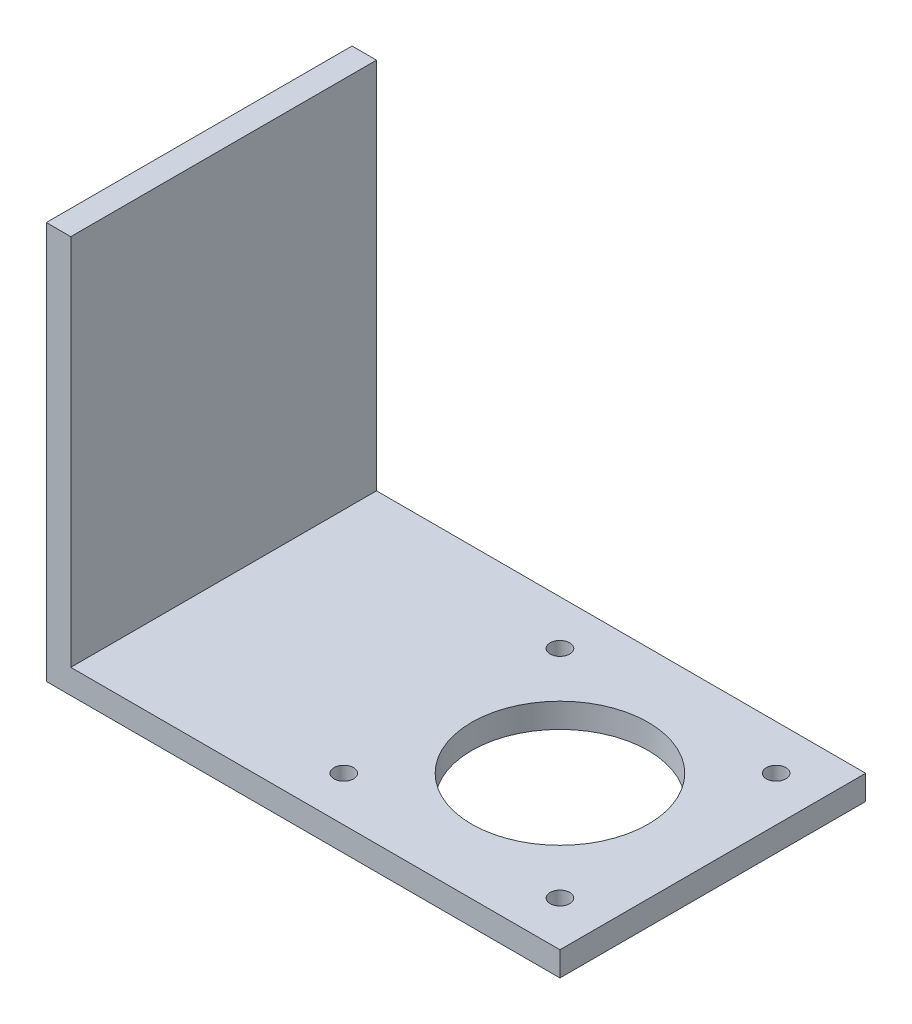
ISO-10303-21;
HEADER;
FILE_DESCRIPTION(('STEP AP214'),'2;1');
FILE_NAME('part.step','',(''),(''),'','','');
FILE_SCHEMA(('AUTOMOTIVE_DESIGN { 1 0 10303 214 1 1 1 1 }'));
ENDSEC;
DATA;
#1=APPLICATION_CONTEXT('core data for automotive mechanical design processes');
#2=APPLICATION_PROTOCOL_DEFINITION('international standard','automotive_design',2000,#1);
#3=PRODUCT_CONTEXT('',#1,'mechanical');
#4=PRODUCT('Part','Part','',(#3));
#5=PRODUCT_RELATED_PRODUCT_CATEGORY('part','',(#4));
#6=PRODUCT_DEFINITION_FORMATION('','',#4);
#7=PRODUCT_DEFINITION_CONTEXT('part definition',#1,'design');
#8=PRODUCT_DEFINITION('design','',#6,#7);
#9=PRODUCT_DEFINITION_SHAPE('','',#8);
#10=(LENGTH_UNIT() NAMED_UNIT(*) SI_UNIT(.MILLI.,.METRE.));
#11=(NAMED_UNIT(*) PLANE_ANGLE_UNIT() SI_UNIT($,.RADIAN.));
#12=(NAMED_UNIT(*) SI_UNIT($,.STERADIAN.) SOLID_ANGLE_UNIT());
#13=UNCERTAINTY_MEASURE_WITH_UNIT(LENGTH_MEASURE(1.E-05),#10,'distance_accuracy_value','');
#14=(GEOMETRIC_REPRESENTATION_CONTEXT(3) GLOBAL_UNCERTAINTY_ASSIGNED_CONTEXT((#13)) GLOBAL_UNIT_ASSIGNED_CONTEXT((#10,
#11,#12)) REPRESENTATION_CONTEXT('',''));
#15=CARTESIAN_POINT('',(0.,0.,0.));
#16=DIRECTION('',(0.,0.,1.));
#17=DIRECTION('',(1.,0.,0.));
#18=AXIS2_PLACEMENT_3D('',#15,#16,#17);
#19=CARTESIAN_POINT('',(0.,4.,0.));
#20=DIRECTION('',(0.,1.,0.));
#21=DIRECTION('',(0.,0.,1.));
#22=AXIS2_PLACEMENT_3D('',#19,#20,#21);
#23=PLANE('',#22);
#24=CARTESIAN_POINT('',(-17.6776695296637,4.,-17.6776695296637));
#25=DIRECTION('',(0.,1.,0.));
#26=DIRECTION('',(0.,0.,1.));
#27=AXIS2_PLACEMENT_3D('',#24,#25,#26);
#28=CIRCLE('',#27,1.6);
#29=CARTESIAN_POINT('',(-17.6776695296637,4.,-16.0776695296637));
#30=VERTEX_POINT('',#29);
#31=EDGE_CURVE('E158',#30,#30,#28,.T.);
#32=ORIENTED_EDGE('',*,*,#31,.F.);
#33=EDGE_LOOP('',(#32));
#34=FACE_BOUND('',#33,.T.);
#35=CARTESIAN_POINT('',(17.6776695296637,4.,17.6776695296637));
#36=DIRECTION('',(0.,1.,0.));
#37=DIRECTION('',(0.,0.,1.));
#38=AXIS2_PLACEMENT_3D('',#35,#36,#37);
#39=CIRCLE('',#38,1.6);
#40=CARTESIAN_POINT('',(17.6776695296637,4.,19.2776695296637));
#41=VERTEX_POINT('',#40);
#42=EDGE_CURVE('E174',#41,#41,#39,.T.);
#43=ORIENTED_EDGE('',*,*,#42,.F.);
#44=EDGE_LOOP('',(#43));
#45=FACE_BOUND('',#44,.T.);
#46=CARTESIAN_POINT('',(-17.6776695296637,4.,17.6776695296637));
#47=DIRECTION('',(0.,1.,0.));
#48=DIRECTION('',(0.,0.,1.));
#49=AXIS2_PLACEMENT_3D('',#46,#47,#48);
#50=CIRCLE('',#49,1.6);
#51=CARTESIAN_POINT('',(-17.6776695296637,4.,19.2776695296637));
#52=VERTEX_POINT('',#51);
#53=EDGE_CURVE('E182',#52,#52,#50,.T.);
#54=ORIENTED_EDGE('',*,*,#53,.F.);
#55=EDGE_LOOP('',(#54));
#56=FACE_BOUND('',#55,.T.);
#57=CARTESIAN_POINT('',(17.6776695296637,4.,-17.6776695296637));
#58=DIRECTION('',(0.,1.,0.));
#59=DIRECTION('',(0.,0.,1.));
#60=AXIS2_PLACEMENT_3D('',#57,#58,#59);
#61=CIRCLE('',#60,1.6);
#62=CARTESIAN_POINT('',(17.6776695296637,4.,-16.0776695296637));
#63=VERTEX_POINT('',#62);
#64=EDGE_CURVE('E166',#63,#63,#61,.T.);
#65=ORIENTED_EDGE('',*,*,#64,.F.);
#66=EDGE_LOOP('',(#65));
#67=FACE_BOUND('',#66,.T.);
#68=CARTESIAN_POINT('',(0.,4.,0.));
#69=DIRECTION('',(0.,1.,0.));
#70=DIRECTION('',(0.,0.,1.));
#71=AXIS2_PLACEMENT_3D('',#68,#69,#70);
#72=CIRCLE('',#71,14.4369133744623);
#73=CARTESIAN_POINT('',(0.,4.,14.4369133744623));
#74=VERTEX_POINT('',#73);
#75=EDGE_CURVE('E150',#74,#74,#72,.T.);
#76=ORIENTED_EDGE('',*,*,#75,.F.);
#77=EDGE_LOOP('',(#76));
#78=FACE_BOUND('',#77,.T.);
#79=DIRECTION('',(-1.,0.,0.));
#80=VECTOR('',#79,1.);
#81=CARTESIAN_POINT('',(-25.,4.,-25.));
#82=LINE('',#81,#80);
#83=CARTESIAN_POINT('',(25.,4.,-25.));
#84=VERTEX_POINT('',#83);
#85=CARTESIAN_POINT('',(-55.,4.,-25.));
#86=VERTEX_POINT('',#85);
#87=EDGE_CURVE('E59',#84,#86,#82,.T.);
#88=ORIENTED_EDGE('',*,*,#87,.T.);
#89=DIRECTION('',(0.,0.,1.));
#90=VECTOR('',#89,1.);
#91=CARTESIAN_POINT('',(-55.,4.,0.));
#92=LINE('',#91,#90);
#93=CARTESIAN_POINT('',(-55.,4.,25.));
#94=VERTEX_POINT('',#93);
#95=EDGE_CURVE('E63',#86,#94,#92,.T.);
#96=ORIENTED_EDGE('',*,*,#95,.T.);
#97=DIRECTION('',(1.,0.,0.));
#98=VECTOR('',#97,1.);
#99=CARTESIAN_POINT('',(-25.,4.,25.));
#100=LINE('',#99,#98);
#101=CARTESIAN_POINT('',(25.,4.,25.));
#102=VERTEX_POINT('',#101);
#103=EDGE_CURVE('E193',#94,#102,#100,.T.);
#104=ORIENTED_EDGE('',*,*,#103,.T.);
#105=DIRECTION('',(0.,0.,-1.));
#106=VECTOR('',#105,1.);
#107=CARTESIAN_POINT('',(25.,4.,-25.));
#108=LINE('',#107,#106);
#109=EDGE_CURVE('E107',#102,#84,#108,.T.);
#110=ORIENTED_EDGE('',*,*,#109,.T.);
#111=EDGE_LOOP('',(#88,#96,#104,#110));
#112=FACE_BOUND('',#111,.T.);
#113=ADVANCED_FACE('F43',(#34,#45,#56,#67,#78,#112),#23,.T.);
#114=CARTESIAN_POINT('',(0.,0.,0.));
#115=DIRECTION('',(0.,1.,0.));
#116=DIRECTION('',(0.,0.,1.));
#117=AXIS2_PLACEMENT_3D('',#114,#115,#116);
#118=PLANE('',#117);
#119=DIRECTION('',(0.,0.,1.));
#120=VECTOR('',#119,1.);
#121=CARTESIAN_POINT('',(-59.,0.,-25.));
#122=LINE('',#121,#120);
#123=CARTESIAN_POINT('',(-59.,0.,-25.));
#124=VERTEX_POINT('',#123);
#125=CARTESIAN_POINT('',(-59.,0.,25.));
#126=VERTEX_POINT('',#125);
#127=EDGE_CURVE('E100',#124,#126,#122,.T.);
#128=ORIENTED_EDGE('',*,*,#127,.F.);
#129=DIRECTION('',(-1.,0.,0.));
#130=VECTOR('',#129,1.);
#131=CARTESIAN_POINT('',(-25.,0.,-25.));
#132=LINE('',#131,#130);
#133=CARTESIAN_POINT('',(25.,0.,-25.));
#134=VERTEX_POINT('',#133);
#135=EDGE_CURVE('E108',#134,#124,#132,.T.);
#136=ORIENTED_EDGE('',*,*,#135,.F.);
#137=DIRECTION('',(0.,0.,-1.));
#138=VECTOR('',#137,1.);
#139=CARTESIAN_POINT('',(25.,0.,-25.));
#140=LINE('',#139,#138);
#141=CARTESIAN_POINT('',(25.,0.,25.));
#142=VERTEX_POINT('',#141);
#143=EDGE_CURVE('E102',#142,#134,#140,.T.);
#144=ORIENTED_EDGE('',*,*,#143,.F.);
#145=DIRECTION('',(1.,0.,0.));
#146=VECTOR('',#145,1.);
#147=CARTESIAN_POINT('',(-25.,0.,25.));
#148=LINE('',#147,#146);
#149=EDGE_CURVE('E95',#126,#142,#148,.T.);
#150=ORIENTED_EDGE('',*,*,#149,.F.);
#151=EDGE_LOOP('',(#128,#136,#144,#150));
#152=FACE_BOUND('',#151,.T.);
#153=CARTESIAN_POINT('',(0.,0.,0.));
#154=DIRECTION('',(0.,1.,0.));
#155=DIRECTION('',(0.,0.,1.));
#156=AXIS2_PLACEMENT_3D('',#153,#154,#155);
#157=CIRCLE('',#156,14.4369133744623);
#158=CARTESIAN_POINT('',(0.,0.,14.4369133744623));
#159=VERTEX_POINT('',#158);
#160=EDGE_CURVE('E149',#159,#159,#157,.T.);
#161=ORIENTED_EDGE('',*,*,#160,.T.);
#162=EDGE_LOOP('',(#161));
#163=FACE_BOUND('',#162,.T.);
#164=CARTESIAN_POINT('',(-17.6776695296637,0.,-17.6776695296637));
#165=DIRECTION('',(0.,1.,0.));
#166=DIRECTION('',(0.,0.,1.));
#167=AXIS2_PLACEMENT_3D('',#164,#165,#166);
#168=CIRCLE('',#167,1.6);
#169=CARTESIAN_POINT('',(-17.6776695296637,0.,-16.0776695296637));
#170=VERTEX_POINT('',#169);
#171=EDGE_CURVE('E154',#170,#170,#168,.T.);
#172=ORIENTED_EDGE('',*,*,#171,.T.);
#173=EDGE_LOOP('',(#172));
#174=FACE_BOUND('',#173,.T.);
#175=CARTESIAN_POINT('',(17.6776695296637,0.,-17.6776695296637));
#176=DIRECTION('',(0.,1.,0.));
#177=DIRECTION('',(0.,0.,1.));
#178=AXIS2_PLACEMENT_3D('',#175,#176,#177);
#179=CIRCLE('',#178,1.6);
#180=CARTESIAN_POINT('',(17.6776695296637,0.,-16.0776695296637));
#181=VERTEX_POINT('',#180);
#182=EDGE_CURVE('E162',#181,#181,#179,.T.);
#183=ORIENTED_EDGE('',*,*,#182,.T.);
#184=EDGE_LOOP('',(#183));
#185=FACE_BOUND('',#184,.T.);
#186=CARTESIAN_POINT('',(17.6776695296637,0.,17.6776695296637));
#187=DIRECTION('',(0.,1.,0.));
#188=DIRECTION('',(0.,0.,1.));
#189=AXIS2_PLACEMENT_3D('',#186,#187,#188);
#190=CIRCLE('',#189,1.6);
#191=CARTESIAN_POINT('',(17.6776695296637,0.,19.2776695296637));
#192=VERTEX_POINT('',#191);
#193=EDGE_CURVE('E170',#192,#192,#190,.T.);
#194=ORIENTED_EDGE('',*,*,#193,.T.);
#195=EDGE_LOOP('',(#194));
#196=FACE_BOUND('',#195,.T.);
#197=CARTESIAN_POINT('',(-17.6776695296637,0.,17.6776695296637));
#198=DIRECTION('',(0.,1.,0.));
#199=DIRECTION('',(0.,0.,1.));
#200=AXIS2_PLACEMENT_3D('',#197,#198,#199);
#201=CIRCLE('',#200,1.6);
#202=CARTESIAN_POINT('',(-17.6776695296637,0.,19.2776695296637));
#203=VERTEX_POINT('',#202);
#204=EDGE_CURVE('E178',#203,#203,#201,.T.);
#205=ORIENTED_EDGE('',*,*,#204,.T.);
#206=EDGE_LOOP('',(#205));
#207=FACE_BOUND('',#206,.T.);
#208=ADVANCED_FACE('F97',(#152,#163,#174,#185,#196,#207),#118,.F.);
#209=CARTESIAN_POINT('',(25.,4.,-25.));
#210=DIRECTION('',(-1.,0.,0.));
#211=DIRECTION('',(0.,0.,1.));
#212=AXIS2_PLACEMENT_3D('',#209,#210,#211);
#213=PLANE('',#212);
#214=ORIENTED_EDGE('',*,*,#143,.T.);
#215=DIRECTION('',(0.,-1.,0.));
#216=VECTOR('',#215,1.);
#217=CARTESIAN_POINT('',(25.,4.,-25.));
#218=LINE('',#217,#216);
#219=EDGE_CURVE('E11',#84,#134,#218,.T.);
#220=ORIENTED_EDGE('',*,*,#219,.F.);
#221=ORIENTED_EDGE('',*,*,#109,.F.);
#222=DIRECTION('',(0.,-1.,0.));
#223=VECTOR('',#222,1.);
#224=CARTESIAN_POINT('',(25.,4.,25.));
#225=LINE('',#224,#223);
#226=EDGE_CURVE('E52',#102,#142,#225,.T.);
#227=ORIENTED_EDGE('',*,*,#226,.T.);
#228=EDGE_LOOP('',(#214,#220,#221,#227));
#229=FACE_BOUND('',#228,.T.);
#230=ADVANCED_FACE('F45',(#229),#213,.F.);
#231=CARTESIAN_POINT('',(-25.,4.,-25.));
#232=DIRECTION('',(0.,0.,1.));
#233=DIRECTION('',(1.,0.,0.));
#234=AXIS2_PLACEMENT_3D('',#231,#232,#233);
#235=PLANE('',#234);
#236=DIRECTION('',(0.,-1.,0.));
#237=VECTOR('',#236,1.);
#238=CARTESIAN_POINT('',(-55.,0.,-25.));
#239=LINE('',#238,#237);
#240=CARTESIAN_POINT('',(-55.,65.,-25.));
#241=VERTEX_POINT('',#240);
#242=EDGE_CURVE('E125',#241,#86,#239,.T.);
#243=ORIENTED_EDGE('',*,*,#242,.T.);
#244=ORIENTED_EDGE('',*,*,#87,.F.);
#245=ORIENTED_EDGE('',*,*,#219,.T.);
#246=ORIENTED_EDGE('',*,*,#135,.T.);
#247=DIRECTION('',(0.,-1.,0.));
#248=VECTOR('',#247,1.);
#249=CARTESIAN_POINT('',(-59.,0.,-25.));
#250=LINE('',#249,#248);
#251=CARTESIAN_POINT('',(-59.,65.,-25.));
#252=VERTEX_POINT('',#251);
#253=EDGE_CURVE('E123',#252,#124,#250,.T.);
#254=ORIENTED_EDGE('',*,*,#253,.F.);
#255=DIRECTION('',(1.,0.,0.));
#256=VECTOR('',#255,1.);
#257=CARTESIAN_POINT('',(-59.,65.,-25.));
#258=LINE('',#257,#256);
#259=EDGE_CURVE('E136',#252,#241,#258,.T.);
#260=ORIENTED_EDGE('',*,*,#259,.T.);
#261=EDGE_LOOP('',(#243,#244,#245,#246,#254,#260));
#262=FACE_BOUND('',#261,.T.);
#263=ADVANCED_FACE('F212',(#262),#235,.F.);
#264=CARTESIAN_POINT('',(-25.,4.,25.));
#265=DIRECTION('',(0.,0.,-1.));
#266=DIRECTION('',(-1.,0.,0.));
#267=AXIS2_PLACEMENT_3D('',#264,#265,#266);
#268=PLANE('',#267);
#269=ORIENTED_EDGE('',*,*,#103,.F.);
#270=DIRECTION('',(0.,1.,0.));
#271=VECTOR('',#270,1.);
#272=CARTESIAN_POINT('',(-55.,0.,25.));
#273=LINE('',#272,#271);
#274=CARTESIAN_POINT('',(-55.,65.,25.));
#275=VERTEX_POINT('',#274);
#276=EDGE_CURVE('E137',#94,#275,#273,.T.);
#277=ORIENTED_EDGE('',*,*,#276,.T.);
#278=DIRECTION('',(1.,0.,0.));
#279=VECTOR('',#278,1.);
#280=CARTESIAN_POINT('',(-59.,65.,25.));
#281=LINE('',#280,#279);
#282=CARTESIAN_POINT('',(-59.,65.,25.));
#283=VERTEX_POINT('',#282);
#284=EDGE_CURVE('E114',#283,#275,#281,.T.);
#285=ORIENTED_EDGE('',*,*,#284,.F.);
#286=DIRECTION('',(0.,1.,0.));
#287=VECTOR('',#286,1.);
#288=CARTESIAN_POINT('',(-59.,0.,25.));
#289=LINE('',#288,#287);
#290=EDGE_CURVE('E111',#126,#283,#289,.T.);
#291=ORIENTED_EDGE('',*,*,#290,.F.);
#292=ORIENTED_EDGE('',*,*,#149,.T.);
#293=ORIENTED_EDGE('',*,*,#226,.F.);
#294=EDGE_LOOP('',(#269,#277,#285,#291,#292,#293));
#295=FACE_BOUND('',#294,.T.);
#296=ADVANCED_FACE('F112',(#295),#268,.F.);
#297=CARTESIAN_POINT('',(-17.6776695296637,4.,17.6776695296637));
#298=DIRECTION('',(0.,-1.,0.));
#299=DIRECTION('',(0.,0.,-1.));
#300=AXIS2_PLACEMENT_3D('',#297,#298,#299);
#301=CYLINDRICAL_SURFACE('',#300,1.6);
#302=ORIENTED_EDGE('',*,*,#53,.T.);
#303=EDGE_LOOP('',(#302));
#304=FACE_BOUND('',#303,.T.);
#305=ORIENTED_EDGE('',*,*,#204,.F.);
#306=EDGE_LOOP('',(#305));
#307=FACE_BOUND('',#306,.T.);
#308=ADVANCED_FACE('F223',(#304,#307),#301,.F.);
#309=CARTESIAN_POINT('',(17.6776695296637,4.,17.6776695296637));
#310=DIRECTION('',(0.,-1.,0.));
#311=DIRECTION('',(0.,0.,-1.));
#312=AXIS2_PLACEMENT_3D('',#309,#310,#311);
#313=CYLINDRICAL_SURFACE('',#312,1.6);
#314=ORIENTED_EDGE('',*,*,#42,.T.);
#315=EDGE_LOOP('',(#314));
#316=FACE_BOUND('',#315,.T.);
#317=ORIENTED_EDGE('',*,*,#193,.F.);
#318=EDGE_LOOP('',(#317));
#319=FACE_BOUND('',#318,.T.);
#320=ADVANCED_FACE('F319',(#316,#319),#313,.F.);
#321=CARTESIAN_POINT('',(17.6776695296637,4.,-17.6776695296637));
#322=DIRECTION('',(0.,-1.,0.));
#323=DIRECTION('',(0.,0.,-1.));
#324=AXIS2_PLACEMENT_3D('',#321,#322,#323);
#325=CYLINDRICAL_SURFACE('',#324,1.6);
#326=ORIENTED_EDGE('',*,*,#64,.T.);
#327=EDGE_LOOP('',(#326));
#328=FACE_BOUND('',#327,.T.);
#329=ORIENTED_EDGE('',*,*,#182,.F.);
#330=EDGE_LOOP('',(#329));
#331=FACE_BOUND('',#330,.T.);
#332=ADVANCED_FACE('F309',(#328,#331),#325,.F.);
#333=CARTESIAN_POINT('',(-17.6776695296637,4.,-17.6776695296637));
#334=DIRECTION('',(0.,-1.,0.));
#335=DIRECTION('',(0.,0.,-1.));
#336=AXIS2_PLACEMENT_3D('',#333,#334,#335);
#337=CYLINDRICAL_SURFACE('',#336,1.6);
#338=ORIENTED_EDGE('',*,*,#31,.T.);
#339=EDGE_LOOP('',(#338));
#340=FACE_BOUND('',#339,.T.);
#341=ORIENTED_EDGE('',*,*,#171,.F.);
#342=EDGE_LOOP('',(#341));
#343=FACE_BOUND('',#342,.T.);
#344=ADVANCED_FACE('F300',(#340,#343),#337,.F.);
#345=CARTESIAN_POINT('',(0.,4.,0.));
#346=DIRECTION('',(0.,-1.,0.));
#347=DIRECTION('',(0.,0.,-1.));
#348=AXIS2_PLACEMENT_3D('',#345,#346,#347);
#349=CYLINDRICAL_SURFACE('',#348,14.4369133744623);
#350=ORIENTED_EDGE('',*,*,#75,.T.);
#351=EDGE_LOOP('',(#350));
#352=FACE_BOUND('',#351,.T.);
#353=ORIENTED_EDGE('',*,*,#160,.F.);
#354=EDGE_LOOP('',(#353));
#355=FACE_BOUND('',#354,.T.);
#356=ADVANCED_FACE('F265',(#352,#355),#349,.F.);
#357=CARTESIAN_POINT('',(-59.,65.,-25.));
#358=DIRECTION('',(0.,-1.,0.));
#359=DIRECTION('',(0.,0.,-1.));
#360=AXIS2_PLACEMENT_3D('',#357,#358,#359);
#361=PLANE('',#360);
#362=DIRECTION('',(0.,0.,-1.));
#363=VECTOR('',#362,1.);
#364=CARTESIAN_POINT('',(-55.,65.,-25.));
#365=LINE('',#364,#363);
#366=EDGE_CURVE('E129',#275,#241,#365,.T.);
#367=ORIENTED_EDGE('',*,*,#366,.T.);
#368=ORIENTED_EDGE('',*,*,#259,.F.);
#369=DIRECTION('',(0.,0.,-1.));
#370=VECTOR('',#369,1.);
#371=CARTESIAN_POINT('',(-59.,65.,-25.));
#372=LINE('',#371,#370);
#373=EDGE_CURVE('E118',#283,#252,#372,.T.);
#374=ORIENTED_EDGE('',*,*,#373,.F.);
#375=ORIENTED_EDGE('',*,*,#284,.T.);
#376=EDGE_LOOP('',(#367,#368,#374,#375));
#377=FACE_BOUND('',#376,.T.);
#378=ADVANCED_FACE('F210',(#377),#361,.F.);
#379=CARTESIAN_POINT('',(-59.,0.,0.));
#380=DIRECTION('',(-1.,0.,0.));
#381=DIRECTION('',(0.,0.,1.));
#382=AXIS2_PLACEMENT_3D('',#379,#380,#381);
#383=PLANE('',#382);
#384=ORIENTED_EDGE('',*,*,#127,.T.);
#385=ORIENTED_EDGE('',*,*,#290,.T.);
#386=ORIENTED_EDGE('',*,*,#373,.T.);
#387=ORIENTED_EDGE('',*,*,#253,.T.);
#388=EDGE_LOOP('',(#384,#385,#386,#387));
#389=FACE_BOUND('',#388,.T.);
#390=ADVANCED_FACE('F121',(#389),#383,.T.);
#391=CARTESIAN_POINT('',(-55.,0.,0.));
#392=DIRECTION('',(-1.,0.,0.));
#393=DIRECTION('',(0.,0.,1.));
#394=AXIS2_PLACEMENT_3D('',#391,#392,#393);
#395=PLANE('',#394);
#396=ORIENTED_EDGE('',*,*,#95,.F.);
#397=ORIENTED_EDGE('',*,*,#242,.F.);
#398=ORIENTED_EDGE('',*,*,#366,.F.);
#399=ORIENTED_EDGE('',*,*,#276,.F.);
#400=EDGE_LOOP('',(#396,#397,#398,#399));
#401=FACE_BOUND('',#400,.T.);
#402=ADVANCED_FACE('F206',(#401),#395,.F.);
#403=CLOSED_SHELL('',(#113,#208,#230,#263,#296,#308,#320,#332,#344,#356,#378,#390,#402));
#404=MANIFOLD_SOLID_BREP('B2',#403);
#405=ADVANCED_BREP_SHAPE_REPRESENTATION('',(#18,#404),#14);
#406=SHAPE_DEFINITION_REPRESENTATION(#9,#405);
ENDSEC;
END-ISO-10303-21;
